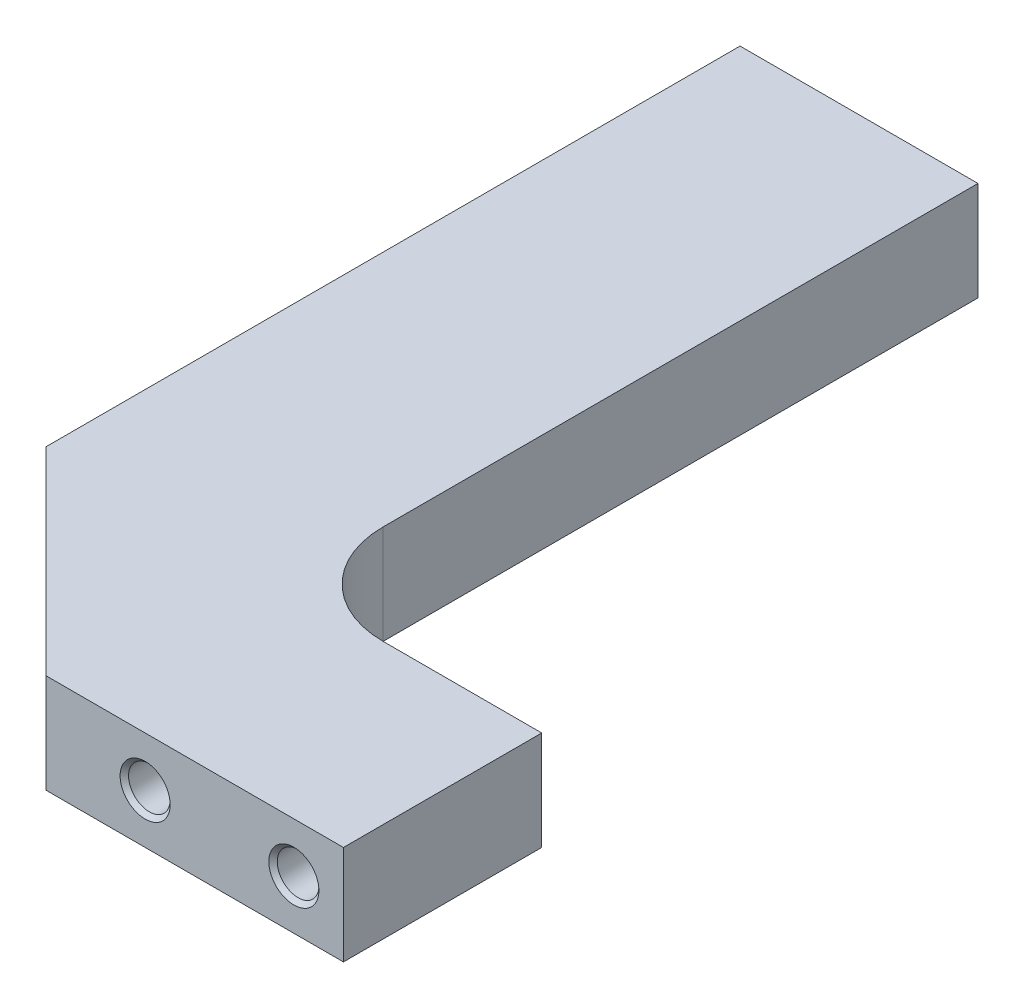
ISO-10303-21;
HEADER;
FILE_DESCRIPTION(('STEP AP214'),'2;1');
FILE_NAME('part.step','',(''),(''),'','','');
FILE_SCHEMA(('AUTOMOTIVE_DESIGN { 1 0 10303 214 1 1 1 1 }'));
ENDSEC;
DATA;
#1=APPLICATION_CONTEXT('core data for automotive mechanical design processes');
#2=APPLICATION_PROTOCOL_DEFINITION('international standard','automotive_design',2000,#1);
#3=PRODUCT_CONTEXT('',#1,'mechanical');
#4=PRODUCT('Part','Part','',(#3));
#5=PRODUCT_RELATED_PRODUCT_CATEGORY('part','',(#4));
#6=PRODUCT_DEFINITION_FORMATION('','',#4);
#7=PRODUCT_DEFINITION_CONTEXT('part definition',#1,'design');
#8=PRODUCT_DEFINITION('design','',#6,#7);
#9=PRODUCT_DEFINITION_SHAPE('','',#8);
#10=(LENGTH_UNIT() NAMED_UNIT(*) SI_UNIT(.MILLI.,.METRE.));
#11=(NAMED_UNIT(*) PLANE_ANGLE_UNIT() SI_UNIT($,.RADIAN.));
#12=(NAMED_UNIT(*) SI_UNIT($,.STERADIAN.) SOLID_ANGLE_UNIT());
#13=UNCERTAINTY_MEASURE_WITH_UNIT(LENGTH_MEASURE(1.E-05),#10,'distance_accuracy_value','');
#14=(GEOMETRIC_REPRESENTATION_CONTEXT(3) GLOBAL_UNCERTAINTY_ASSIGNED_CONTEXT((#13)) GLOBAL_UNIT_ASSIGNED_CONTEXT((#10,
#11,#12)) REPRESENTATION_CONTEXT('',''));
#15=CARTESIAN_POINT('',(0.,0.,0.));
#16=DIRECTION('',(0.,0.,1.));
#17=DIRECTION('',(1.,0.,0.));
#18=AXIS2_PLACEMENT_3D('',#15,#16,#17);
#19=CARTESIAN_POINT('',(45.,5.,90.));
#20=DIRECTION('',(0.,0.,1.));
#21=DIRECTION('',(1.,0.,0.));
#22=AXIS2_PLACEMENT_3D('',#19,#20,#21);
#23=CONICAL_SURFACE('',#22,2.525,0.785398163397465);
#24=CARTESIAN_POINT('',(45.,5.,89.575));
#25=DIRECTION('',(0.,0.,1.));
#26=DIRECTION('',(1.,0.,0.));
#27=AXIS2_PLACEMENT_3D('',#24,#25,#26);
#28=CIRCLE('',#27,2.1);
#29=CARTESIAN_POINT('',(47.1,5.,89.575));
#30=VERTEX_POINT('',#29);
#31=EDGE_CURVE('E11',#30,#30,#28,.T.);
#32=ORIENTED_EDGE('',*,*,#31,.F.);
#33=EDGE_LOOP('',(#32));
#34=FACE_BOUND('',#33,.T.);
#35=CARTESIAN_POINT('',(45.,5.,90.));
#36=DIRECTION('',(0.,0.,1.));
#37=DIRECTION('',(1.,0.,0.));
#38=AXIS2_PLACEMENT_3D('',#35,#36,#37);
#39=CIRCLE('',#38,2.525);
#40=CARTESIAN_POINT('',(47.525,5.,90.));
#41=VERTEX_POINT('',#40);
#42=EDGE_CURVE('E231',#41,#41,#39,.T.);
#43=ORIENTED_EDGE('',*,*,#42,.T.);
#44=EDGE_LOOP('',(#43));
#45=FACE_BOUND('',#44,.T.);
#46=ADVANCED_FACE('F17',(#34,#45),#23,.F.);
#47=CARTESIAN_POINT('',(45.,5.,90.));
#48=DIRECTION('',(0.,0.,1.));
#49=DIRECTION('',(1.,0.,0.));
#50=AXIS2_PLACEMENT_3D('',#47,#48,#49);
#51=CYLINDRICAL_SURFACE('',#50,2.1);
#52=CARTESIAN_POINT('',(45.,5.,72.));
#53=DIRECTION('',(0.,0.,1.));
#54=DIRECTION('',(1.,0.,0.));
#55=AXIS2_PLACEMENT_3D('',#52,#53,#54);
#56=CIRCLE('',#55,2.1);
#57=CARTESIAN_POINT('',(47.1,5.,72.));
#58=VERTEX_POINT('',#57);
#59=EDGE_CURVE('E27',#58,#58,#56,.T.);
#60=ORIENTED_EDGE('',*,*,#59,.F.);
#61=EDGE_LOOP('',(#60));
#62=FACE_BOUND('',#61,.T.);
#63=ORIENTED_EDGE('',*,*,#31,.T.);
#64=EDGE_LOOP('',(#63));
#65=FACE_BOUND('',#64,.T.);
#66=ADVANCED_FACE('F19',(#62,#65),#51,.F.);
#67=CARTESIAN_POINT('',(45.,5.,72.));
#68=DIRECTION('',(0.,0.,1.));
#69=DIRECTION('',(1.,0.,0.));
#70=AXIS2_PLACEMENT_3D('',#67,#68,#69);
#71=CONICAL_SURFACE('',#70,2.1,1.02974425867665);
#72=CARTESIAN_POINT('',(45.,5.,70.7381927000421));
#73=VERTEX_POINT('',#72);
#74=VERTEX_LOOP('',#73);
#75=FACE_BOUND('',#74,.T.);
#76=ORIENTED_EDGE('',*,*,#59,.T.);
#77=EDGE_LOOP('',(#76));
#78=FACE_BOUND('',#77,.T.);
#79=ADVANCED_FACE('F333',(#75,#78),#71,.F.);
#80=CARTESIAN_POINT('',(30.,5.,90.));
#81=DIRECTION('',(0.,0.,1.));
#82=DIRECTION('',(1.,0.,0.));
#83=AXIS2_PLACEMENT_3D('',#80,#81,#82);
#84=CONICAL_SURFACE('',#83,2.525,0.785398163397465);
#85=CARTESIAN_POINT('',(30.,5.,89.575));
#86=DIRECTION('',(0.,0.,1.));
#87=DIRECTION('',(1.,0.,0.));
#88=AXIS2_PLACEMENT_3D('',#85,#86,#87);
#89=CIRCLE('',#88,2.1);
#90=CARTESIAN_POINT('',(32.1,5.,89.575));
#91=VERTEX_POINT('',#90);
#92=EDGE_CURVE('E268',#91,#91,#89,.T.);
#93=ORIENTED_EDGE('',*,*,#92,.F.);
#94=EDGE_LOOP('',(#93));
#95=FACE_BOUND('',#94,.T.);
#96=CARTESIAN_POINT('',(30.,5.,90.));
#97=DIRECTION('',(0.,0.,1.));
#98=DIRECTION('',(1.,0.,0.));
#99=AXIS2_PLACEMENT_3D('',#96,#97,#98);
#100=CIRCLE('',#99,2.525);
#101=CARTESIAN_POINT('',(32.525,5.,90.));
#102=VERTEX_POINT('',#101);
#103=EDGE_CURVE('E230',#102,#102,#100,.T.);
#104=ORIENTED_EDGE('',*,*,#103,.T.);
#105=EDGE_LOOP('',(#104));
#106=FACE_BOUND('',#105,.T.);
#107=ADVANCED_FACE('F356',(#95,#106),#84,.F.);
#108=CARTESIAN_POINT('',(30.,5.,90.));
#109=DIRECTION('',(0.,0.,1.));
#110=DIRECTION('',(1.,0.,0.));
#111=AXIS2_PLACEMENT_3D('',#108,#109,#110);
#112=CYLINDRICAL_SURFACE('',#111,2.1);
#113=CARTESIAN_POINT('',(30.,5.,72.));
#114=DIRECTION('',(0.,0.,1.));
#115=DIRECTION('',(1.,0.,0.));
#116=AXIS2_PLACEMENT_3D('',#113,#114,#115);
#117=CIRCLE('',#116,2.1);
#118=CARTESIAN_POINT('',(32.1,5.,72.));
#119=VERTEX_POINT('',#118);
#120=EDGE_CURVE('E21',#119,#119,#117,.T.);
#121=ORIENTED_EDGE('',*,*,#120,.F.);
#122=EDGE_LOOP('',(#121));
#123=FACE_BOUND('',#122,.T.);
#124=ORIENTED_EDGE('',*,*,#92,.T.);
#125=EDGE_LOOP('',(#124));
#126=FACE_BOUND('',#125,.T.);
#127=ADVANCED_FACE('F354',(#123,#126),#112,.F.);
#128=CARTESIAN_POINT('',(30.,5.,72.));
#129=DIRECTION('',(0.,0.,1.));
#130=DIRECTION('',(1.,0.,0.));
#131=AXIS2_PLACEMENT_3D('',#128,#129,#130);
#132=CONICAL_SURFACE('',#131,2.1,1.02974425867665);
#133=CARTESIAN_POINT('',(30.,5.,70.7381927000421));
#134=VERTEX_POINT('',#133);
#135=VERTEX_LOOP('',#134);
#136=FACE_BOUND('',#135,.T.);
#137=ORIENTED_EDGE('',*,*,#120,.T.);
#138=EDGE_LOOP('',(#137));
#139=FACE_BOUND('',#138,.T.);
#140=ADVANCED_FACE('F348',(#136,#139),#132,.F.);
#141=CARTESIAN_POINT('',(20.,10.,90.));
#142=DIRECTION('',(0.707106781186549,0.,-0.707106781186546));
#143=DIRECTION('',(0.,-1.,0.));
#144=AXIS2_PLACEMENT_3D('',#141,#142,#143);
#145=PLANE('',#144);
#146=DIRECTION('',(0.707106781186546,0.,0.707106781186549));
#147=VECTOR('',#146,1.);
#148=CARTESIAN_POINT('',(12.,10.,82.));
#149=LINE('',#148,#147);
#150=CARTESIAN_POINT('',(0.,10.,70.));
#151=VERTEX_POINT('',#150);
#152=CARTESIAN_POINT('',(20.,10.,90.));
#153=VERTEX_POINT('',#152);
#154=EDGE_CURVE('E207',#151,#153,#149,.T.);
#155=ORIENTED_EDGE('',*,*,#154,.F.);
#156=DIRECTION('',(0.,1.,0.));
#157=VECTOR('',#156,1.);
#158=CARTESIAN_POINT('',(0.,10.,70.));
#159=LINE('',#158,#157);
#160=CARTESIAN_POINT('',(0.,0.,70.));
#161=VERTEX_POINT('',#160);
#162=EDGE_CURVE('E187',#161,#151,#159,.T.);
#163=ORIENTED_EDGE('',*,*,#162,.F.);
#164=DIRECTION('',(-0.707106781186546,0.,-0.707106781186549));
#165=VECTOR('',#164,1.);
#166=CARTESIAN_POINT('',(20.,0.,90.));
#167=LINE('',#166,#165);
#168=CARTESIAN_POINT('',(20.,0.,90.));
#169=VERTEX_POINT('',#168);
#170=EDGE_CURVE('E184',#169,#161,#167,.T.);
#171=ORIENTED_EDGE('',*,*,#170,.F.);
#172=DIRECTION('',(0.,-1.,0.));
#173=VECTOR('',#172,1.);
#174=CARTESIAN_POINT('',(20.,10.,90.));
#175=LINE('',#174,#173);
#176=EDGE_CURVE('E204',#153,#169,#175,.T.);
#177=ORIENTED_EDGE('',*,*,#176,.F.);
#178=EDGE_LOOP('',(#155,#163,#171,#177));
#179=FACE_BOUND('',#178,.T.);
#180=ADVANCED_FACE('F305',(#179),#145,.F.);
#181=CARTESIAN_POINT('',(20.,5.,0.));
#182=DIRECTION('',(0.,0.,-1.));
#183=DIRECTION('',(-1.,0.,0.));
#184=AXIS2_PLACEMENT_3D('',#181,#182,#183);
#185=CONICAL_SURFACE('',#184,2.525,0.785398163397448);
#186=CARTESIAN_POINT('',(20.,5.,0.425));
#187=DIRECTION('',(0.,0.,-1.));
#188=DIRECTION('',(-1.,0.,0.));
#189=AXIS2_PLACEMENT_3D('',#186,#187,#188);
#190=CIRCLE('',#189,2.1);
#191=CARTESIAN_POINT('',(17.9,5.,0.425));
#192=VERTEX_POINT('',#191);
#193=EDGE_CURVE('E258',#192,#192,#190,.T.);
#194=ORIENTED_EDGE('',*,*,#193,.F.);
#195=EDGE_LOOP('',(#194));
#196=FACE_BOUND('',#195,.T.);
#197=CARTESIAN_POINT('',(20.,5.,0.));
#198=DIRECTION('',(0.,0.,-1.));
#199=DIRECTION('',(-1.,0.,0.));
#200=AXIS2_PLACEMENT_3D('',#197,#198,#199);
#201=CIRCLE('',#200,2.525);
#202=CARTESIAN_POINT('',(17.475,5.,0.));
#203=VERTEX_POINT('',#202);
#204=EDGE_CURVE('E275',#203,#203,#201,.T.);
#205=ORIENTED_EDGE('',*,*,#204,.T.);
#206=EDGE_LOOP('',(#205));
#207=FACE_BOUND('',#206,.T.);
#208=ADVANCED_FACE('F299',(#196,#207),#185,.F.);
#209=CARTESIAN_POINT('',(20.,5.,0.));
#210=DIRECTION('',(0.,0.,-1.));
#211=DIRECTION('',(-1.,0.,0.));
#212=AXIS2_PLACEMENT_3D('',#209,#210,#211);
#213=CYLINDRICAL_SURFACE('',#212,2.1);
#214=CARTESIAN_POINT('',(20.,5.,20.));
#215=DIRECTION('',(0.,0.,-1.));
#216=DIRECTION('',(-1.,0.,0.));
#217=AXIS2_PLACEMENT_3D('',#214,#215,#216);
#218=CIRCLE('',#217,2.1);
#219=CARTESIAN_POINT('',(17.9,5.,20.));
#220=VERTEX_POINT('',#219);
#221=EDGE_CURVE('E261',#220,#220,#218,.T.);
#222=ORIENTED_EDGE('',*,*,#221,.F.);
#223=EDGE_LOOP('',(#222));
#224=FACE_BOUND('',#223,.T.);
#225=ORIENTED_EDGE('',*,*,#193,.T.);
#226=EDGE_LOOP('',(#225));
#227=FACE_BOUND('',#226,.T.);
#228=ADVANCED_FACE('F296',(#224,#227),#213,.F.);
#229=CARTESIAN_POINT('',(20.,5.,20.));
#230=DIRECTION('',(0.,0.,-1.));
#231=DIRECTION('',(-1.,0.,0.));
#232=AXIS2_PLACEMENT_3D('',#229,#230,#231);
#233=CONICAL_SURFACE('',#232,2.1,1.02974425867665);
#234=CARTESIAN_POINT('',(20.,5.,21.2618072999579));
#235=VERTEX_POINT('',#234);
#236=VERTEX_LOOP('',#235);
#237=FACE_BOUND('',#236,.T.);
#238=ORIENTED_EDGE('',*,*,#221,.T.);
#239=EDGE_LOOP('',(#238));
#240=FACE_BOUND('',#239,.T.);
#241=ADVANCED_FACE('F294',(#237,#240),#233,.F.);
#242=CARTESIAN_POINT('',(8.,5.,0.));
#243=DIRECTION('',(0.,0.,-1.));
#244=DIRECTION('',(-1.,0.,0.));
#245=AXIS2_PLACEMENT_3D('',#242,#243,#244);
#246=CONICAL_SURFACE('',#245,2.525,0.785398163397446);
#247=CARTESIAN_POINT('',(8.,5.,0.425));
#248=DIRECTION('',(0.,0.,-1.));
#249=DIRECTION('',(-1.,0.,0.));
#250=AXIS2_PLACEMENT_3D('',#247,#248,#249);
#251=CIRCLE('',#250,2.1);
#252=CARTESIAN_POINT('',(5.9,5.,0.425));
#253=VERTEX_POINT('',#252);
#254=EDGE_CURVE('E287',#253,#253,#251,.T.);
#255=ORIENTED_EDGE('',*,*,#254,.F.);
#256=EDGE_LOOP('',(#255));
#257=FACE_BOUND('',#256,.T.);
#258=CARTESIAN_POINT('',(8.,5.,0.));
#259=DIRECTION('',(0.,0.,-1.));
#260=DIRECTION('',(-1.,0.,0.));
#261=AXIS2_PLACEMENT_3D('',#258,#259,#260);
#262=CIRCLE('',#261,2.525);
#263=CARTESIAN_POINT('',(5.475,5.,0.));
#264=VERTEX_POINT('',#263);
#265=EDGE_CURVE('E278',#264,#264,#262,.T.);
#266=ORIENTED_EDGE('',*,*,#265,.T.);
#267=EDGE_LOOP('',(#266));
#268=FACE_BOUND('',#267,.T.);
#269=ADVANCED_FACE('F342',(#257,#268),#246,.F.);
#270=CARTESIAN_POINT('',(8.,5.,0.));
#271=DIRECTION('',(0.,0.,-1.));
#272=DIRECTION('',(-1.,0.,0.));
#273=AXIS2_PLACEMENT_3D('',#270,#271,#272);
#274=CYLINDRICAL_SURFACE('',#273,2.1);
#275=CARTESIAN_POINT('',(8.,5.,20.));
#276=DIRECTION('',(0.,0.,-1.));
#277=DIRECTION('',(-1.,0.,0.));
#278=AXIS2_PLACEMENT_3D('',#275,#276,#277);
#279=CIRCLE('',#278,2.1);
#280=CARTESIAN_POINT('',(5.9,5.,20.));
#281=VERTEX_POINT('',#280);
#282=EDGE_CURVE('E206',#281,#281,#279,.T.);
#283=ORIENTED_EDGE('',*,*,#282,.F.);
#284=EDGE_LOOP('',(#283));
#285=FACE_BOUND('',#284,.T.);
#286=ORIENTED_EDGE('',*,*,#254,.T.);
#287=EDGE_LOOP('',(#286));
#288=FACE_BOUND('',#287,.T.);
#289=ADVANCED_FACE('F341',(#285,#288),#274,.F.);
#290=CARTESIAN_POINT('',(8.,5.,20.));
#291=DIRECTION('',(0.,0.,-1.));
#292=DIRECTION('',(-1.,0.,0.));
#293=AXIS2_PLACEMENT_3D('',#290,#291,#292);
#294=CONICAL_SURFACE('',#293,2.1,1.02974425867665);
#295=CARTESIAN_POINT('',(8.,5.,21.2618072999579));
#296=VERTEX_POINT('',#295);
#297=VERTEX_LOOP('',#296);
#298=FACE_BOUND('',#297,.T.);
#299=ORIENTED_EDGE('',*,*,#282,.T.);
#300=EDGE_LOOP('',(#299));
#301=FACE_BOUND('',#300,.T.);
#302=ADVANCED_FACE('F338',(#298,#301),#294,.F.);
#303=CARTESIAN_POINT('',(34.,0.,60.));
#304=DIRECTION('',(0.,1.,0.));
#305=DIRECTION('',(1.,0.,0.));
#306=AXIS2_PLACEMENT_3D('',#303,#304,#305);
#307=PLANE('',#306);
#308=DIRECTION('',(1.,0.,0.));
#309=VECTOR('',#308,1.);
#310=CARTESIAN_POINT('',(35.,0.,90.));
#311=LINE('',#310,#309);
#312=CARTESIAN_POINT('',(50.,0.,90.));
#313=VERTEX_POINT('',#312);
#314=EDGE_CURVE('E214',#169,#313,#311,.T.);
#315=ORIENTED_EDGE('',*,*,#314,.F.);
#316=ORIENTED_EDGE('',*,*,#170,.T.);
#317=DIRECTION('',(0.,0.,1.));
#318=VECTOR('',#317,1.);
#319=CARTESIAN_POINT('',(0.,0.,0.));
#320=LINE('',#319,#318);
#321=CARTESIAN_POINT('',(0.,0.,0.));
#322=VERTEX_POINT('',#321);
#323=EDGE_CURVE('E176',#322,#161,#320,.T.);
#324=ORIENTED_EDGE('',*,*,#323,.F.);
#325=DIRECTION('',(-1.,0.,0.));
#326=VECTOR('',#325,1.);
#327=CARTESIAN_POINT('',(0.,0.,0.));
#328=LINE('',#327,#326);
#329=CARTESIAN_POINT('',(24.,0.,0.));
#330=VERTEX_POINT('',#329);
#331=EDGE_CURVE('E158',#330,#322,#328,.T.);
#332=ORIENTED_EDGE('',*,*,#331,.F.);
#333=DIRECTION('',(0.,0.,-1.));
#334=VECTOR('',#333,1.);
#335=CARTESIAN_POINT('',(24.,0.,0.));
#336=LINE('',#335,#334);
#337=CARTESIAN_POINT('',(24.,0.,60.));
#338=VERTEX_POINT('',#337);
#339=EDGE_CURVE('E265',#338,#330,#336,.T.);
#340=ORIENTED_EDGE('',*,*,#339,.F.);
#341=CARTESIAN_POINT('',(34.,0.,60.));
#342=DIRECTION('',(0.,-1.,0.));
#343=DIRECTION('',(0.,0.,1.));
#344=AXIS2_PLACEMENT_3D('',#341,#342,#343);
#345=CIRCLE('',#344,10.);
#346=CARTESIAN_POINT('',(34.,0.,70.));
#347=VERTEX_POINT('',#346);
#348=EDGE_CURVE('E246',#347,#338,#345,.T.);
#349=ORIENTED_EDGE('',*,*,#348,.F.);
#350=DIRECTION('',(-1.,0.,0.));
#351=VECTOR('',#350,1.);
#352=CARTESIAN_POINT('',(34.,0.,70.));
#353=LINE('',#352,#351);
#354=CARTESIAN_POINT('',(50.,0.,70.));
#355=VERTEX_POINT('',#354);
#356=EDGE_CURVE('E199',#355,#347,#353,.T.);
#357=ORIENTED_EDGE('',*,*,#356,.F.);
#358=DIRECTION('',(0.,0.,-1.));
#359=VECTOR('',#358,1.);
#360=CARTESIAN_POINT('',(50.,0.,90.));
#361=LINE('',#360,#359);
#362=EDGE_CURVE('E222',#313,#355,#361,.T.);
#363=ORIENTED_EDGE('',*,*,#362,.F.);
#364=EDGE_LOOP('',(#315,#316,#324,#332,#340,#349,#357,#363));
#365=FACE_BOUND('',#364,.T.);
#366=ADVANCED_FACE('F183',(#365),#307,.F.);
#367=CARTESIAN_POINT('',(34.,10.,60.));
#368=DIRECTION('',(0.,1.,0.));
#369=DIRECTION('',(1.,0.,0.));
#370=AXIS2_PLACEMENT_3D('',#367,#368,#369);
#371=PLANE('',#370);
#372=DIRECTION('',(0.,0.,1.));
#373=VECTOR('',#372,1.);
#374=CARTESIAN_POINT('',(0.,10.,0.));
#375=LINE('',#374,#373);
#376=CARTESIAN_POINT('',(0.,10.,0.));
#377=VERTEX_POINT('',#376);
#378=EDGE_CURVE('E178',#377,#151,#375,.T.);
#379=ORIENTED_EDGE('',*,*,#378,.T.);
#380=ORIENTED_EDGE('',*,*,#154,.T.);
#381=DIRECTION('',(1.,0.,0.));
#382=VECTOR('',#381,1.);
#383=CARTESIAN_POINT('',(0.,10.,90.));
#384=LINE('',#383,#382);
#385=CARTESIAN_POINT('',(50.,10.,90.));
#386=VERTEX_POINT('',#385);
#387=EDGE_CURVE('E180',#153,#386,#384,.T.);
#388=ORIENTED_EDGE('',*,*,#387,.T.);
#389=DIRECTION('',(0.,0.,-1.));
#390=VECTOR('',#389,1.);
#391=CARTESIAN_POINT('',(50.,10.,90.));
#392=LINE('',#391,#390);
#393=CARTESIAN_POINT('',(50.,10.,70.));
#394=VERTEX_POINT('',#393);
#395=EDGE_CURVE('E195',#386,#394,#392,.T.);
#396=ORIENTED_EDGE('',*,*,#395,.T.);
#397=DIRECTION('',(-1.,0.,0.));
#398=VECTOR('',#397,1.);
#399=CARTESIAN_POINT('',(34.,10.,70.));
#400=LINE('',#399,#398);
#401=CARTESIAN_POINT('',(34.,10.,70.));
#402=VERTEX_POINT('',#401);
#403=EDGE_CURVE('E240',#394,#402,#400,.T.);
#404=ORIENTED_EDGE('',*,*,#403,.T.);
#405=CARTESIAN_POINT('',(34.,10.,60.));
#406=DIRECTION('',(0.,-1.,0.));
#407=DIRECTION('',(0.,0.,1.));
#408=AXIS2_PLACEMENT_3D('',#405,#406,#407);
#409=CIRCLE('',#408,10.);
#410=CARTESIAN_POINT('',(24.,10.,60.));
#411=VERTEX_POINT('',#410);
#412=EDGE_CURVE('E257',#402,#411,#409,.T.);
#413=ORIENTED_EDGE('',*,*,#412,.T.);
#414=DIRECTION('',(0.,0.,-1.));
#415=VECTOR('',#414,1.);
#416=CARTESIAN_POINT('',(24.,10.,0.));
#417=LINE('',#416,#415);
#418=CARTESIAN_POINT('',(24.,10.,0.));
#419=VERTEX_POINT('',#418);
#420=EDGE_CURVE('E170',#411,#419,#417,.T.);
#421=ORIENTED_EDGE('',*,*,#420,.T.);
#422=DIRECTION('',(-1.,0.,0.));
#423=VECTOR('',#422,1.);
#424=CARTESIAN_POINT('',(0.,10.,0.));
#425=LINE('',#424,#423);
#426=EDGE_CURVE('E169',#419,#377,#425,.T.);
#427=ORIENTED_EDGE('',*,*,#426,.T.);
#428=EDGE_LOOP('',(#379,#380,#388,#396,#404,#413,#421,#427));
#429=FACE_BOUND('',#428,.T.);
#430=ADVANCED_FACE('F311',(#429),#371,.T.);
#431=CARTESIAN_POINT('',(0.,10.,0.));
#432=DIRECTION('',(0.,0.,1.));
#433=DIRECTION('',(1.,0.,0.));
#434=AXIS2_PLACEMENT_3D('',#431,#432,#433);
#435=PLANE('',#434);
#436=ORIENTED_EDGE('',*,*,#265,.F.);
#437=EDGE_LOOP('',(#436));
#438=FACE_BOUND('',#437,.T.);
#439=ORIENTED_EDGE('',*,*,#204,.F.);
#440=EDGE_LOOP('',(#439));
#441=FACE_BOUND('',#440,.T.);
#442=ORIENTED_EDGE('',*,*,#331,.T.);
#443=DIRECTION('',(0.,-1.,0.));
#444=VECTOR('',#443,1.);
#445=CARTESIAN_POINT('',(0.,10.,0.));
#446=LINE('',#445,#444);
#447=EDGE_CURVE('E161',#377,#322,#446,.T.);
#448=ORIENTED_EDGE('',*,*,#447,.F.);
#449=ORIENTED_EDGE('',*,*,#426,.F.);
#450=DIRECTION('',(0.,-1.,0.));
#451=VECTOR('',#450,1.);
#452=CARTESIAN_POINT('',(24.,10.,0.));
#453=LINE('',#452,#451);
#454=EDGE_CURVE('E164',#419,#330,#453,.T.);
#455=ORIENTED_EDGE('',*,*,#454,.T.);
#456=EDGE_LOOP('',(#442,#448,#449,#455));
#457=FACE_BOUND('',#456,.T.);
#458=ADVANCED_FACE('F160',(#438,#441,#457),#435,.F.);
#459=CARTESIAN_POINT('',(24.,10.,0.));
#460=DIRECTION('',(-1.,0.,0.));
#461=DIRECTION('',(0.,1.,0.));
#462=AXIS2_PLACEMENT_3D('',#459,#460,#461);
#463=PLANE('',#462);
#464=ORIENTED_EDGE('',*,*,#339,.T.);
#465=ORIENTED_EDGE('',*,*,#454,.F.);
#466=ORIENTED_EDGE('',*,*,#420,.F.);
#467=DIRECTION('',(0.,-1.,0.));
#468=VECTOR('',#467,1.);
#469=CARTESIAN_POINT('',(24.,10.,60.));
#470=LINE('',#469,#468);
#471=EDGE_CURVE('E250',#411,#338,#470,.T.);
#472=ORIENTED_EDGE('',*,*,#471,.T.);
#473=EDGE_LOOP('',(#464,#465,#466,#472));
#474=FACE_BOUND('',#473,.T.);
#475=ADVANCED_FACE('F310',(#474),#463,.F.);
#476=CARTESIAN_POINT('',(34.,10.,60.));
#477=DIRECTION('',(0.,-1.,0.));
#478=DIRECTION('',(0.,0.,-1.));
#479=AXIS2_PLACEMENT_3D('',#476,#477,#478);
#480=CYLINDRICAL_SURFACE('',#479,10.);
#481=ORIENTED_EDGE('',*,*,#348,.T.);
#482=ORIENTED_EDGE('',*,*,#471,.F.);
#483=ORIENTED_EDGE('',*,*,#412,.F.);
#484=DIRECTION('',(0.,-1.,0.));
#485=VECTOR('',#484,1.);
#486=CARTESIAN_POINT('',(34.,10.,70.));
#487=LINE('',#486,#485);
#488=EDGE_CURVE('E218',#402,#347,#487,.T.);
#489=ORIENTED_EDGE('',*,*,#488,.T.);
#490=EDGE_LOOP('',(#481,#482,#483,#489));
#491=FACE_BOUND('',#490,.T.);
#492=ADVANCED_FACE('F320',(#491),#480,.F.);
#493=CARTESIAN_POINT('',(34.,10.,70.));
#494=DIRECTION('',(0.,0.,1.));
#495=DIRECTION('',(1.,0.,0.));
#496=AXIS2_PLACEMENT_3D('',#493,#494,#495);
#497=PLANE('',#496);
#498=ORIENTED_EDGE('',*,*,#356,.T.);
#499=ORIENTED_EDGE('',*,*,#488,.F.);
#500=ORIENTED_EDGE('',*,*,#403,.F.);
#501=DIRECTION('',(0.,-1.,0.));
#502=VECTOR('',#501,1.);
#503=CARTESIAN_POINT('',(50.,10.,70.));
#504=LINE('',#503,#502);
#505=EDGE_CURVE('E200',#394,#355,#504,.T.);
#506=ORIENTED_EDGE('',*,*,#505,.T.);
#507=EDGE_LOOP('',(#498,#499,#500,#506));
#508=FACE_BOUND('',#507,.T.);
#509=ADVANCED_FACE('F523',(#508),#497,.F.);
#510=CARTESIAN_POINT('',(50.,10.,90.));
#511=DIRECTION('',(-1.,0.,0.));
#512=DIRECTION('',(0.,0.,1.));
#513=AXIS2_PLACEMENT_3D('',#510,#511,#512);
#514=PLANE('',#513);
#515=ORIENTED_EDGE('',*,*,#362,.T.);
#516=ORIENTED_EDGE('',*,*,#505,.F.);
#517=ORIENTED_EDGE('',*,*,#395,.F.);
#518=DIRECTION('',(0.,-1.,0.));
#519=VECTOR('',#518,1.);
#520=CARTESIAN_POINT('',(50.,10.,90.));
#521=LINE('',#520,#519);
#522=EDGE_CURVE('E225',#386,#313,#521,.T.);
#523=ORIENTED_EDGE('',*,*,#522,.T.);
#524=EDGE_LOOP('',(#515,#516,#517,#523));
#525=FACE_BOUND('',#524,.T.);
#526=ADVANCED_FACE('F536',(#525),#514,.F.);
#527=CARTESIAN_POINT('',(35.,10.,90.));
#528=DIRECTION('',(0.,0.,-1.));
#529=DIRECTION('',(0.,-1.,0.));
#530=AXIS2_PLACEMENT_3D('',#527,#528,#529);
#531=PLANE('',#530);
#532=ORIENTED_EDGE('',*,*,#103,.F.);
#533=EDGE_LOOP('',(#532));
#534=FACE_BOUND('',#533,.T.);
#535=ORIENTED_EDGE('',*,*,#42,.F.);
#536=EDGE_LOOP('',(#535));
#537=FACE_BOUND('',#536,.T.);
#538=ORIENTED_EDGE('',*,*,#387,.F.);
#539=ORIENTED_EDGE('',*,*,#176,.T.);
#540=ORIENTED_EDGE('',*,*,#314,.T.);
#541=ORIENTED_EDGE('',*,*,#522,.F.);
#542=EDGE_LOOP('',(#538,#539,#540,#541));
#543=FACE_BOUND('',#542,.T.);
#544=ADVANCED_FACE('F547',(#534,#537,#543),#531,.F.);
#545=CARTESIAN_POINT('',(0.,10.,0.));
#546=DIRECTION('',(1.,0.,0.));
#547=DIRECTION('',(0.,0.,-1.));
#548=AXIS2_PLACEMENT_3D('',#545,#546,#547);
#549=PLANE('',#548);
#550=ORIENTED_EDGE('',*,*,#323,.T.);
#551=ORIENTED_EDGE('',*,*,#162,.T.);
#552=ORIENTED_EDGE('',*,*,#378,.F.);
#553=ORIENTED_EDGE('',*,*,#447,.T.);
#554=EDGE_LOOP('',(#550,#551,#552,#553));
#555=FACE_BOUND('',#554,.T.);
#556=ADVANCED_FACE('F174',(#555),#549,.F.);
#557=CLOSED_SHELL('',(#46,#66,#79,#107,#127,#140,#180,#208,#228,#241,#269,#289,#302,#366,#430,
#458,#475,#492,#509,#526,#544,#556));
#558=MANIFOLD_SOLID_BREP('B1',#557);
#559=ADVANCED_BREP_SHAPE_REPRESENTATION('',(#18,#558),#14);
#560=SHAPE_DEFINITION_REPRESENTATION(#9,#559);
ENDSEC;
END-ISO-10303-21;
